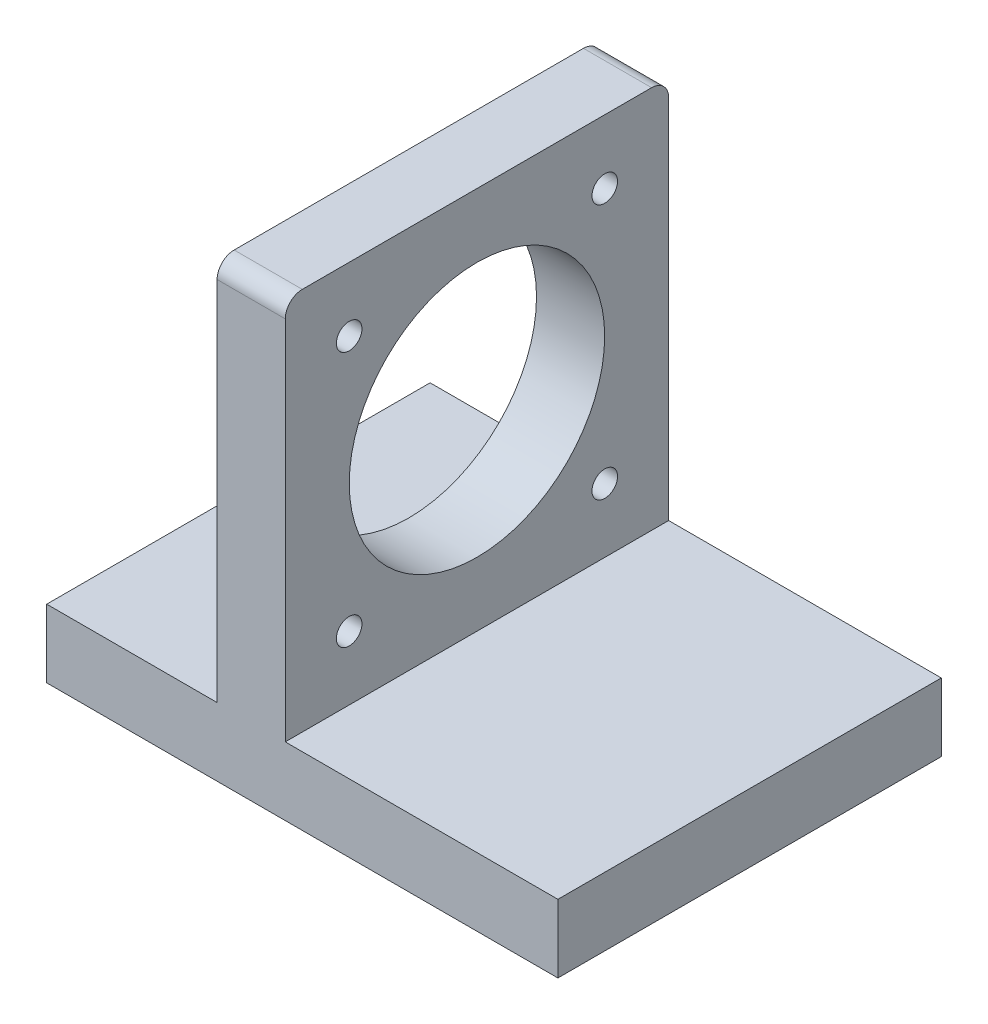
ISO-10303-21;
HEADER;
FILE_DESCRIPTION(('STEP AP214'),'2;1');
FILE_NAME('part.step','',(''),(''),'','','');
FILE_SCHEMA(('AUTOMOTIVE_DESIGN { 1 0 10303 214 1 1 1 1 }'));
ENDSEC;
DATA;
#1=APPLICATION_CONTEXT('core data for automotive mechanical design processes');
#2=APPLICATION_PROTOCOL_DEFINITION('international standard','automotive_design',2000,#1);
#3=PRODUCT_CONTEXT('',#1,'mechanical');
#4=PRODUCT('Part','Part','',(#3));
#5=PRODUCT_RELATED_PRODUCT_CATEGORY('part','',(#4));
#6=PRODUCT_DEFINITION_FORMATION('','',#4);
#7=PRODUCT_DEFINITION_CONTEXT('part definition',#1,'design');
#8=PRODUCT_DEFINITION('design','',#6,#7);
#9=PRODUCT_DEFINITION_SHAPE('','',#8);
#10=(LENGTH_UNIT() NAMED_UNIT(*) SI_UNIT(.MILLI.,.METRE.));
#11=(NAMED_UNIT(*) PLANE_ANGLE_UNIT() SI_UNIT($,.RADIAN.));
#12=(NAMED_UNIT(*) SI_UNIT($,.STERADIAN.) SOLID_ANGLE_UNIT());
#13=UNCERTAINTY_MEASURE_WITH_UNIT(LENGTH_MEASURE(1.E-05),#10,'distance_accuracy_value','');
#14=(GEOMETRIC_REPRESENTATION_CONTEXT(3) GLOBAL_UNCERTAINTY_ASSIGNED_CONTEXT((#13)) GLOBAL_UNIT_ASSIGNED_CONTEXT((#10,
#11,#12)) REPRESENTATION_CONTEXT('',''));
#15=CARTESIAN_POINT('',(0.,0.,0.));
#16=DIRECTION('',(0.,0.,1.));
#17=DIRECTION('',(1.,0.,0.));
#18=AXIS2_PLACEMENT_3D('',#15,#16,#17);
#19=CARTESIAN_POINT('',(0.,8.,0.));
#20=DIRECTION('',(0.,1.,0.));
#21=DIRECTION('',(0.,0.,1.));
#22=AXIS2_PLACEMENT_3D('',#19,#20,#21);
#23=PLANE('',#22);
#24=DIRECTION('',(0.,0.,-1.));
#25=VECTOR('',#24,1.);
#26=CARTESIAN_POINT('',(-2.,8.,22.5));
#27=LINE('',#26,#25);
#28=CARTESIAN_POINT('',(-2.,8.,22.5));
#29=VERTEX_POINT('',#28);
#30=CARTESIAN_POINT('',(-2.00000000000001,8.,-22.5));
#31=VERTEX_POINT('',#30);
#32=EDGE_CURVE('E160',#29,#31,#27,.T.);
#33=ORIENTED_EDGE('',*,*,#32,.F.);
#34=DIRECTION('',(1.,0.,0.));
#35=VECTOR('',#34,1.);
#36=CARTESIAN_POINT('',(-30.,8.,22.5));
#37=LINE('',#36,#35);
#38=CARTESIAN_POINT('',(30.,8.,22.5));
#39=VERTEX_POINT('',#38);
#40=EDGE_CURVE('E156',#29,#39,#37,.T.);
#41=ORIENTED_EDGE('',*,*,#40,.T.);
#42=DIRECTION('',(0.,0.,-1.));
#43=VECTOR('',#42,1.);
#44=CARTESIAN_POINT('',(30.,8.,-22.5));
#45=LINE('',#44,#43);
#46=CARTESIAN_POINT('',(30.,8.,-22.5));
#47=VERTEX_POINT('',#46);
#48=EDGE_CURVE('E222',#39,#47,#45,.T.);
#49=ORIENTED_EDGE('',*,*,#48,.T.);
#50=DIRECTION('',(-1.,0.,0.));
#51=VECTOR('',#50,1.);
#52=CARTESIAN_POINT('',(-30.,8.,-22.5));
#53=LINE('',#52,#51);
#54=EDGE_CURVE('E227',#47,#31,#53,.T.);
#55=ORIENTED_EDGE('',*,*,#54,.T.);
#56=EDGE_LOOP('',(#33,#41,#49,#55));
#57=FACE_BOUND('',#56,.T.);
#58=ADVANCED_FACE('F33',(#57),#23,.T.);
#59=CARTESIAN_POINT('',(30.,8.,-22.5));
#60=DIRECTION('',(-1.,0.,0.));
#61=DIRECTION('',(0.,0.,1.));
#62=AXIS2_PLACEMENT_3D('',#59,#60,#61);
#63=PLANE('',#62);
#64=DIRECTION('',(0.,0.,-1.));
#65=VECTOR('',#64,1.);
#66=CARTESIAN_POINT('',(30.,0.,-22.5));
#67=LINE('',#66,#65);
#68=CARTESIAN_POINT('',(30.,0.,22.5));
#69=VERTEX_POINT('',#68);
#70=CARTESIAN_POINT('',(30.,0.,-22.5));
#71=VERTEX_POINT('',#70);
#72=EDGE_CURVE('E213',#69,#71,#67,.T.);
#73=ORIENTED_EDGE('',*,*,#72,.T.);
#74=DIRECTION('',(0.,-1.,0.));
#75=VECTOR('',#74,1.);
#76=CARTESIAN_POINT('',(30.,8.,-22.5));
#77=LINE('',#76,#75);
#78=EDGE_CURVE('E245',#47,#71,#77,.T.);
#79=ORIENTED_EDGE('',*,*,#78,.F.);
#80=ORIENTED_EDGE('',*,*,#48,.F.);
#81=DIRECTION('',(0.,-1.,0.));
#82=VECTOR('',#81,1.);
#83=CARTESIAN_POINT('',(30.,8.,22.5));
#84=LINE('',#83,#82);
#85=EDGE_CURVE('E155',#39,#69,#84,.T.);
#86=ORIENTED_EDGE('',*,*,#85,.T.);
#87=EDGE_LOOP('',(#73,#79,#80,#86));
#88=FACE_BOUND('',#87,.T.);
#89=ADVANCED_FACE('F291',(#88),#63,.F.);
#90=CARTESIAN_POINT('',(-30.,8.,-22.5));
#91=DIRECTION('',(0.,0.,1.));
#92=DIRECTION('',(1.,0.,0.));
#93=AXIS2_PLACEMENT_3D('',#90,#91,#92);
#94=PLANE('',#93);
#95=DIRECTION('',(0.,-1.,0.));
#96=VECTOR('',#95,1.);
#97=CARTESIAN_POINT('',(-10.,53.,-22.5));
#98=LINE('',#97,#96);
#99=CARTESIAN_POINT('',(-10.,51.,-22.5));
#100=VERTEX_POINT('',#99);
#101=CARTESIAN_POINT('',(-10.,8.,-22.5));
#102=VERTEX_POINT('',#101);
#103=EDGE_CURVE('E144',#100,#102,#98,.T.);
#104=ORIENTED_EDGE('',*,*,#103,.F.);
#105=DIRECTION('',(-1.,0.,0.));
#106=VECTOR('',#105,1.);
#107=CARTESIAN_POINT('',(-2.,51.,-22.5));
#108=LINE('',#107,#106);
#109=CARTESIAN_POINT('',(-2.,51.,-22.5));
#110=VERTEX_POINT('',#109);
#111=EDGE_CURVE('E57',#100,#110,#108,.F.);
#112=ORIENTED_EDGE('',*,*,#111,.T.);
#113=DIRECTION('',(0.,-1.,0.));
#114=VECTOR('',#113,1.);
#115=CARTESIAN_POINT('',(-2.,53.,-22.5));
#116=LINE('',#115,#114);
#117=EDGE_CURVE('E173',#110,#31,#116,.T.);
#118=ORIENTED_EDGE('',*,*,#117,.T.);
#119=ORIENTED_EDGE('',*,*,#54,.F.);
#120=ORIENTED_EDGE('',*,*,#78,.T.);
#121=DIRECTION('',(-1.,0.,0.));
#122=VECTOR('',#121,1.);
#123=CARTESIAN_POINT('',(-30.,0.,-22.5));
#124=LINE('',#123,#122);
#125=CARTESIAN_POINT('',(-30.,0.,-22.5));
#126=VERTEX_POINT('',#125);
#127=EDGE_CURVE('E233',#71,#126,#124,.T.);
#128=ORIENTED_EDGE('',*,*,#127,.T.);
#129=DIRECTION('',(0.,-1.,0.));
#130=VECTOR('',#129,1.);
#131=CARTESIAN_POINT('',(-30.,8.,-22.5));
#132=LINE('',#131,#130);
#133=CARTESIAN_POINT('',(-30.,8.,-22.5));
#134=VERTEX_POINT('',#133);
#135=EDGE_CURVE('E242',#134,#126,#132,.T.);
#136=ORIENTED_EDGE('',*,*,#135,.F.);
#137=EDGE_CURVE('E225',#102,#134,#53,.T.);
#138=ORIENTED_EDGE('',*,*,#137,.F.);
#139=EDGE_LOOP('',(#104,#112,#118,#119,#120,#128,#136,#138));
#140=FACE_BOUND('',#139,.T.);
#141=ADVANCED_FACE('F279',(#140),#94,.F.);
#142=CARTESIAN_POINT('',(-30.,8.,-22.5));
#143=DIRECTION('',(1.,0.,0.));
#144=DIRECTION('',(0.,0.,-1.));
#145=AXIS2_PLACEMENT_3D('',#142,#143,#144);
#146=PLANE('',#145);
#147=DIRECTION('',(0.,0.,1.));
#148=VECTOR('',#147,1.);
#149=CARTESIAN_POINT('',(-30.,0.,-22.5));
#150=LINE('',#149,#148);
#151=CARTESIAN_POINT('',(-30.,0.,22.5));
#152=VERTEX_POINT('',#151);
#153=EDGE_CURVE('E235',#126,#152,#150,.T.);
#154=ORIENTED_EDGE('',*,*,#153,.T.);
#155=DIRECTION('',(0.,-1.,0.));
#156=VECTOR('',#155,1.);
#157=CARTESIAN_POINT('',(-30.,8.,22.5));
#158=LINE('',#157,#156);
#159=CARTESIAN_POINT('',(-30.,8.,22.5));
#160=VERTEX_POINT('',#159);
#161=EDGE_CURVE('E240',#160,#152,#158,.T.);
#162=ORIENTED_EDGE('',*,*,#161,.F.);
#163=DIRECTION('',(0.,0.,1.));
#164=VECTOR('',#163,1.);
#165=CARTESIAN_POINT('',(-30.,8.,-22.5));
#166=LINE('',#165,#164);
#167=EDGE_CURVE('E153',#134,#160,#166,.T.);
#168=ORIENTED_EDGE('',*,*,#167,.F.);
#169=ORIENTED_EDGE('',*,*,#135,.T.);
#170=EDGE_LOOP('',(#154,#162,#168,#169));
#171=FACE_BOUND('',#170,.T.);
#172=ADVANCED_FACE('F283',(#171),#146,.F.);
#173=CARTESIAN_POINT('',(-30.,8.,22.5));
#174=DIRECTION('',(0.,0.,-1.));
#175=DIRECTION('',(-1.,0.,0.));
#176=AXIS2_PLACEMENT_3D('',#173,#174,#175);
#177=PLANE('',#176);
#178=DIRECTION('',(0.,-1.,0.));
#179=VECTOR('',#178,1.);
#180=CARTESIAN_POINT('',(-2.,53.,22.5));
#181=LINE('',#180,#179);
#182=CARTESIAN_POINT('',(-2.,51.,22.5));
#183=VERTEX_POINT('',#182);
#184=EDGE_CURVE('E145',#183,#29,#181,.T.);
#185=ORIENTED_EDGE('',*,*,#184,.F.);
#186=DIRECTION('',(1.,0.,0.));
#187=VECTOR('',#186,1.);
#188=CARTESIAN_POINT('',(-9.99999999999999,51.,22.5));
#189=LINE('',#188,#187);
#190=CARTESIAN_POINT('',(-9.99999999999999,51.,22.5));
#191=VERTEX_POINT('',#190);
#192=EDGE_CURVE('E11',#183,#191,#189,.F.);
#193=ORIENTED_EDGE('',*,*,#192,.T.);
#194=DIRECTION('',(0.,-1.,0.));
#195=VECTOR('',#194,1.);
#196=CARTESIAN_POINT('',(-9.99999999999999,53.,22.5));
#197=LINE('',#196,#195);
#198=CARTESIAN_POINT('',(-9.99999999999999,8.,22.5));
#199=VERTEX_POINT('',#198);
#200=EDGE_CURVE('E135',#191,#199,#197,.T.);
#201=ORIENTED_EDGE('',*,*,#200,.T.);
#202=EDGE_CURVE('E139',#160,#199,#37,.T.);
#203=ORIENTED_EDGE('',*,*,#202,.F.);
#204=ORIENTED_EDGE('',*,*,#161,.T.);
#205=DIRECTION('',(1.,0.,0.));
#206=VECTOR('',#205,1.);
#207=CARTESIAN_POINT('',(-30.,0.,22.5));
#208=LINE('',#207,#206);
#209=EDGE_CURVE('E226',#152,#69,#208,.T.);
#210=ORIENTED_EDGE('',*,*,#209,.T.);
#211=ORIENTED_EDGE('',*,*,#85,.F.);
#212=ORIENTED_EDGE('',*,*,#40,.F.);
#213=EDGE_LOOP('',(#185,#193,#201,#203,#204,#210,#211,#212));
#214=FACE_BOUND('',#213,.T.);
#215=ADVANCED_FACE('F137',(#214),#177,.F.);
#216=DIRECTION('',(0.,0.,1.));
#217=VECTOR('',#216,1.);
#218=CARTESIAN_POINT('',(-9.99999999999999,8.,22.5));
#219=LINE('',#218,#217);
#220=EDGE_CURVE('E150',#102,#199,#219,.T.);
#221=ORIENTED_EDGE('',*,*,#220,.F.);
#222=ORIENTED_EDGE('',*,*,#137,.T.);
#223=ORIENTED_EDGE('',*,*,#167,.T.);
#224=ORIENTED_EDGE('',*,*,#202,.T.);
#225=EDGE_LOOP('',(#221,#222,#223,#224));
#226=FACE_BOUND('',#225,.T.);
#227=ADVANCED_FACE('F149',(#226),#23,.T.);
#228=CARTESIAN_POINT('',(0.,0.,0.));
#229=DIRECTION('',(0.,1.,0.));
#230=DIRECTION('',(0.,0.,1.));
#231=AXIS2_PLACEMENT_3D('',#228,#229,#230);
#232=PLANE('',#231);
#233=DIRECTION('',(1.,0.,0.));
#234=VECTOR('',#233,1.);
#235=CARTESIAN_POINT('',(-9.99999999999999,0.,-20.));
#236=LINE('',#235,#234);
#237=CARTESIAN_POINT('',(-9.99999999999999,0.,-20.));
#238=VERTEX_POINT('',#237);
#239=CARTESIAN_POINT('',(10.,0.,-20.));
#240=VERTEX_POINT('',#239);
#241=EDGE_CURVE('E193',#238,#240,#236,.T.);
#242=ORIENTED_EDGE('',*,*,#241,.F.);
#243=DIRECTION('',(0.,0.,-1.));
#244=VECTOR('',#243,1.);
#245=CARTESIAN_POINT('',(-10.,0.,20.));
#246=LINE('',#245,#244);
#247=CARTESIAN_POINT('',(-10.,0.,20.));
#248=VERTEX_POINT('',#247);
#249=EDGE_CURVE('E177',#248,#238,#246,.T.);
#250=ORIENTED_EDGE('',*,*,#249,.F.);
#251=DIRECTION('',(-1.,0.,0.));
#252=VECTOR('',#251,1.);
#253=CARTESIAN_POINT('',(-10.,0.,20.));
#254=LINE('',#253,#252);
#255=CARTESIAN_POINT('',(10.,0.,20.));
#256=VERTEX_POINT('',#255);
#257=EDGE_CURVE('E182',#256,#248,#254,.T.);
#258=ORIENTED_EDGE('',*,*,#257,.F.);
#259=DIRECTION('',(0.,0.,1.));
#260=VECTOR('',#259,1.);
#261=CARTESIAN_POINT('',(10.,0.,20.));
#262=LINE('',#261,#260);
#263=EDGE_CURVE('E196',#240,#256,#262,.T.);
#264=ORIENTED_EDGE('',*,*,#263,.F.);
#265=EDGE_LOOP('',(#242,#250,#258,#264));
#266=FACE_BOUND('',#265,.T.);
#267=CARTESIAN_POINT('',(-20.,0.,14.5));
#268=DIRECTION('',(0.,-1.,0.));
#269=DIRECTION('',(0.,0.,-1.));
#270=AXIS2_PLACEMENT_3D('',#267,#268,#269);
#271=CIRCLE('',#270,5.);
#272=CARTESIAN_POINT('',(-20.,0.,9.50000000000001));
#273=VERTEX_POINT('',#272);
#274=EDGE_CURVE('E214',#273,#273,#271,.T.);
#275=ORIENTED_EDGE('',*,*,#274,.F.);
#276=EDGE_LOOP('',(#275));
#277=FACE_BOUND('',#276,.T.);
#278=CARTESIAN_POINT('',(-20.,0.,-14.5));
#279=DIRECTION('',(0.,-1.,0.));
#280=DIRECTION('',(0.,0.,-1.));
#281=AXIS2_PLACEMENT_3D('',#278,#279,#280);
#282=CIRCLE('',#281,5.);
#283=CARTESIAN_POINT('',(-20.,0.,-19.5));
#284=VERTEX_POINT('',#283);
#285=EDGE_CURVE('E203',#284,#284,#282,.T.);
#286=ORIENTED_EDGE('',*,*,#285,.F.);
#287=EDGE_LOOP('',(#286));
#288=FACE_BOUND('',#287,.T.);
#289=ORIENTED_EDGE('',*,*,#72,.F.);
#290=ORIENTED_EDGE('',*,*,#209,.F.);
#291=ORIENTED_EDGE('',*,*,#153,.F.);
#292=ORIENTED_EDGE('',*,*,#127,.F.);
#293=EDGE_LOOP('',(#289,#290,#291,#292));
#294=FACE_BOUND('',#293,.T.);
#295=ADVANCED_FACE('F288',(#266,#277,#288,#294),#232,.F.);
#296=CARTESIAN_POINT('',(-20.,5.,-14.5));
#297=DIRECTION('',(0.,-1.,0.));
#298=DIRECTION('',(0.,0.,-1.));
#299=AXIS2_PLACEMENT_3D('',#296,#297,#298);
#300=CYLINDRICAL_SURFACE('',#299,5.);
#301=CARTESIAN_POINT('',(-20.,5.,-14.5));
#302=DIRECTION('',(0.,-1.,0.));
#303=DIRECTION('',(0.,0.,-1.));
#304=AXIS2_PLACEMENT_3D('',#301,#302,#303);
#305=CIRCLE('',#304,5.);
#306=CARTESIAN_POINT('',(-20.,5.,-19.5));
#307=VERTEX_POINT('',#306);
#308=EDGE_CURVE('E217',#307,#307,#305,.T.);
#309=ORIENTED_EDGE('',*,*,#308,.F.);
#310=EDGE_LOOP('',(#309));
#311=FACE_BOUND('',#310,.T.);
#312=ORIENTED_EDGE('',*,*,#285,.T.);
#313=EDGE_LOOP('',(#312));
#314=FACE_BOUND('',#313,.T.);
#315=ADVANCED_FACE('F309',(#311,#314),#300,.F.);
#316=CARTESIAN_POINT('',(-20.,5.,-14.5));
#317=DIRECTION('',(0.,-1.,0.));
#318=DIRECTION('',(0.,0.,-1.));
#319=AXIS2_PLACEMENT_3D('',#316,#317,#318);
#320=PLANE('',#319);
#321=ORIENTED_EDGE('',*,*,#308,.T.);
#322=EDGE_LOOP('',(#321));
#323=FACE_BOUND('',#322,.T.);
#324=ADVANCED_FACE('F378',(#323),#320,.T.);
#325=CARTESIAN_POINT('',(-20.,5.,14.5));
#326=DIRECTION('',(0.,-1.,0.));
#327=DIRECTION('',(0.,0.,-1.));
#328=AXIS2_PLACEMENT_3D('',#325,#326,#327);
#329=CYLINDRICAL_SURFACE('',#328,5.);
#330=CARTESIAN_POINT('',(-20.,5.,14.5));
#331=DIRECTION('',(0.,-1.,0.));
#332=DIRECTION('',(0.,0.,-1.));
#333=AXIS2_PLACEMENT_3D('',#330,#331,#332);
#334=CIRCLE('',#333,5.);
#335=CARTESIAN_POINT('',(-20.,5.,9.50000000000001));
#336=VERTEX_POINT('',#335);
#337=EDGE_CURVE('E210',#336,#336,#334,.T.);
#338=ORIENTED_EDGE('',*,*,#337,.F.);
#339=EDGE_LOOP('',(#338));
#340=FACE_BOUND('',#339,.T.);
#341=ORIENTED_EDGE('',*,*,#274,.T.);
#342=EDGE_LOOP('',(#341));
#343=FACE_BOUND('',#342,.T.);
#344=ADVANCED_FACE('F374',(#340,#343),#329,.F.);
#345=CARTESIAN_POINT('',(-20.,5.,14.5));
#346=DIRECTION('',(0.,-1.,0.));
#347=DIRECTION('',(0.,0.,-1.));
#348=AXIS2_PLACEMENT_3D('',#345,#346,#347);
#349=PLANE('',#348);
#350=ORIENTED_EDGE('',*,*,#337,.T.);
#351=EDGE_LOOP('',(#350));
#352=FACE_BOUND('',#351,.T.);
#353=ADVANCED_FACE('F370',(#352),#349,.T.);
#354=CARTESIAN_POINT('',(-10.,5.,20.));
#355=DIRECTION('',(-1.,0.,0.));
#356=DIRECTION('',(0.,0.,1.));
#357=AXIS2_PLACEMENT_3D('',#354,#355,#356);
#358=PLANE('',#357);
#359=ORIENTED_EDGE('',*,*,#249,.T.);
#360=DIRECTION('',(0.,-1.,0.));
#361=VECTOR('',#360,1.);
#362=CARTESIAN_POINT('',(-9.99999999999999,5.,-20.));
#363=LINE('',#362,#361);
#364=CARTESIAN_POINT('',(-9.99999999999999,5.,-20.));
#365=VERTEX_POINT('',#364);
#366=EDGE_CURVE('E191',#365,#238,#363,.T.);
#367=ORIENTED_EDGE('',*,*,#366,.F.);
#368=DIRECTION('',(0.,0.,-1.));
#369=VECTOR('',#368,1.);
#370=CARTESIAN_POINT('',(-10.,5.,20.));
#371=LINE('',#370,#369);
#372=CARTESIAN_POINT('',(-10.,5.,20.));
#373=VERTEX_POINT('',#372);
#374=EDGE_CURVE('E178',#373,#365,#371,.T.);
#375=ORIENTED_EDGE('',*,*,#374,.F.);
#376=DIRECTION('',(0.,-1.,0.));
#377=VECTOR('',#376,1.);
#378=CARTESIAN_POINT('',(-10.,5.,20.));
#379=LINE('',#378,#377);
#380=EDGE_CURVE('E201',#373,#248,#379,.T.);
#381=ORIENTED_EDGE('',*,*,#380,.T.);
#382=EDGE_LOOP('',(#359,#367,#375,#381));
#383=FACE_BOUND('',#382,.T.);
#384=ADVANCED_FACE('F360',(#383),#358,.F.);
#385=CARTESIAN_POINT('',(-10.,5.,20.));
#386=DIRECTION('',(0.,0.,1.));
#387=DIRECTION('',(1.,0.,0.));
#388=AXIS2_PLACEMENT_3D('',#385,#386,#387);
#389=PLANE('',#388);
#390=ORIENTED_EDGE('',*,*,#257,.T.);
#391=ORIENTED_EDGE('',*,*,#380,.F.);
#392=DIRECTION('',(-1.,0.,0.));
#393=VECTOR('',#392,1.);
#394=CARTESIAN_POINT('',(-10.,5.,20.));
#395=LINE('',#394,#393);
#396=CARTESIAN_POINT('',(10.,5.,20.));
#397=VERTEX_POINT('',#396);
#398=EDGE_CURVE('E188',#397,#373,#395,.T.);
#399=ORIENTED_EDGE('',*,*,#398,.F.);
#400=DIRECTION('',(0.,-1.,0.));
#401=VECTOR('',#400,1.);
#402=CARTESIAN_POINT('',(10.,5.,20.));
#403=LINE('',#402,#401);
#404=EDGE_CURVE('E204',#397,#256,#403,.T.);
#405=ORIENTED_EDGE('',*,*,#404,.T.);
#406=EDGE_LOOP('',(#390,#391,#399,#405));
#407=FACE_BOUND('',#406,.T.);
#408=ADVANCED_FACE('F356',(#407),#389,.F.);
#409=CARTESIAN_POINT('',(10.,5.,20.));
#410=DIRECTION('',(1.,0.,0.));
#411=DIRECTION('',(0.,0.,-1.));
#412=AXIS2_PLACEMENT_3D('',#409,#410,#411);
#413=PLANE('',#412);
#414=ORIENTED_EDGE('',*,*,#263,.T.);
#415=ORIENTED_EDGE('',*,*,#404,.F.);
#416=DIRECTION('',(0.,0.,1.));
#417=VECTOR('',#416,1.);
#418=CARTESIAN_POINT('',(10.,5.,20.));
#419=LINE('',#418,#417);
#420=CARTESIAN_POINT('',(10.,5.,-20.));
#421=VERTEX_POINT('',#420);
#422=EDGE_CURVE('E185',#421,#397,#419,.T.);
#423=ORIENTED_EDGE('',*,*,#422,.F.);
#424=DIRECTION('',(0.,-1.,0.));
#425=VECTOR('',#424,1.);
#426=CARTESIAN_POINT('',(10.,5.,-20.));
#427=LINE('',#426,#425);
#428=EDGE_CURVE('E206',#421,#240,#427,.T.);
#429=ORIENTED_EDGE('',*,*,#428,.T.);
#430=EDGE_LOOP('',(#414,#415,#423,#429));
#431=FACE_BOUND('',#430,.T.);
#432=ADVANCED_FACE('F359',(#431),#413,.F.);
#433=CARTESIAN_POINT('',(-9.99999999999999,5.,-20.));
#434=DIRECTION('',(0.,0.,-1.));
#435=DIRECTION('',(-1.,0.,0.));
#436=AXIS2_PLACEMENT_3D('',#433,#434,#435);
#437=PLANE('',#436);
#438=ORIENTED_EDGE('',*,*,#241,.T.);
#439=ORIENTED_EDGE('',*,*,#428,.F.);
#440=DIRECTION('',(1.,0.,0.));
#441=VECTOR('',#440,1.);
#442=CARTESIAN_POINT('',(-9.99999999999999,5.,-20.));
#443=LINE('',#442,#441);
#444=EDGE_CURVE('E181',#365,#421,#443,.T.);
#445=ORIENTED_EDGE('',*,*,#444,.F.);
#446=ORIENTED_EDGE('',*,*,#366,.T.);
#447=EDGE_LOOP('',(#438,#439,#445,#446));
#448=FACE_BOUND('',#447,.T.);
#449=ADVANCED_FACE('F354',(#448),#437,.F.);
#450=CARTESIAN_POINT('',(0.,5.,0.));
#451=DIRECTION('',(0.,-1.,0.));
#452=DIRECTION('',(0.,0.,-1.));
#453=AXIS2_PLACEMENT_3D('',#450,#451,#452);
#454=PLANE('',#453);
#455=ORIENTED_EDGE('',*,*,#374,.T.);
#456=ORIENTED_EDGE('',*,*,#444,.T.);
#457=ORIENTED_EDGE('',*,*,#422,.T.);
#458=ORIENTED_EDGE('',*,*,#398,.T.);
#459=EDGE_LOOP('',(#455,#456,#457,#458));
#460=FACE_BOUND('',#459,.T.);
#461=ADVANCED_FACE('F350',(#460),#454,.T.);
#462=CARTESIAN_POINT('',(-9.99999999999999,53.,22.5));
#463=DIRECTION('',(1.,0.,0.));
#464=DIRECTION('',(0.,0.,-1.));
#465=AXIS2_PLACEMENT_3D('',#462,#463,#464);
#466=PLANE('',#465);
#467=CARTESIAN_POINT('',(-10.,30.5,0.));
#468=DIRECTION('',(-1.,0.,0.));
#469=DIRECTION('',(0.,0.,1.));
#470=AXIS2_PLACEMENT_3D('',#467,#468,#469);
#471=CIRCLE('',#470,14.9902404199975);
#472=CARTESIAN_POINT('',(-10.,30.5,14.9902404199975));
#473=VERTEX_POINT('',#472);
#474=EDGE_CURVE('E542',#473,#473,#471,.T.);
#475=ORIENTED_EDGE('',*,*,#474,.F.);
#476=EDGE_LOOP('',(#475));
#477=FACE_BOUND('',#476,.T.);
#478=CARTESIAN_POINT('',(-10.,15.5,-15.));
#479=DIRECTION('',(-1.,0.,0.));
#480=DIRECTION('',(0.,0.,1.));
#481=AXIS2_PLACEMENT_3D('',#478,#479,#480);
#482=CIRCLE('',#481,1.5);
#483=CARTESIAN_POINT('',(-10.,15.5,-13.5));
#484=VERTEX_POINT('',#483);
#485=EDGE_CURVE('E545',#484,#484,#482,.T.);
#486=ORIENTED_EDGE('',*,*,#485,.F.);
#487=EDGE_LOOP('',(#486));
#488=FACE_BOUND('',#487,.T.);
#489=CARTESIAN_POINT('',(-10.,15.5,15.));
#490=DIRECTION('',(-1.,0.,0.));
#491=DIRECTION('',(0.,0.,1.));
#492=AXIS2_PLACEMENT_3D('',#489,#490,#491);
#493=CIRCLE('',#492,1.5);
#494=CARTESIAN_POINT('',(-10.,15.5,16.5));
#495=VERTEX_POINT('',#494);
#496=EDGE_CURVE('E546',#495,#495,#493,.T.);
#497=ORIENTED_EDGE('',*,*,#496,.F.);
#498=EDGE_LOOP('',(#497));
#499=FACE_BOUND('',#498,.T.);
#500=CARTESIAN_POINT('',(-10.,45.5,15.));
#501=DIRECTION('',(-1.,0.,0.));
#502=DIRECTION('',(0.,0.,1.));
#503=AXIS2_PLACEMENT_3D('',#500,#501,#502);
#504=CIRCLE('',#503,1.5);
#505=CARTESIAN_POINT('',(-10.,45.5,16.5));
#506=VERTEX_POINT('',#505);
#507=EDGE_CURVE('E550',#506,#506,#504,.T.);
#508=ORIENTED_EDGE('',*,*,#507,.F.);
#509=EDGE_LOOP('',(#508));
#510=FACE_BOUND('',#509,.T.);
#511=CARTESIAN_POINT('',(-10.,45.5,-15.));
#512=DIRECTION('',(-1.,0.,0.));
#513=DIRECTION('',(0.,0.,1.));
#514=AXIS2_PLACEMENT_3D('',#511,#512,#513);
#515=CIRCLE('',#514,1.5);
#516=CARTESIAN_POINT('',(-10.,45.5,-13.5));
#517=VERTEX_POINT('',#516);
#518=EDGE_CURVE('E253',#517,#517,#515,.T.);
#519=ORIENTED_EDGE('',*,*,#518,.F.);
#520=EDGE_LOOP('',(#519));
#521=FACE_BOUND('',#520,.T.);
#522=DIRECTION('',(0.,0.,1.));
#523=VECTOR('',#522,1.);
#524=CARTESIAN_POINT('',(-9.99999999999999,53.,22.5));
#525=LINE('',#524,#523);
#526=CARTESIAN_POINT('',(-10.,53.,-20.5));
#527=VERTEX_POINT('',#526);
#528=CARTESIAN_POINT('',(-9.99999999999999,53.,20.5));
#529=VERTEX_POINT('',#528);
#530=EDGE_CURVE('E164',#527,#529,#525,.T.);
#531=ORIENTED_EDGE('',*,*,#530,.F.);
#532=CARTESIAN_POINT('',(-10.,51.,-20.5));
#533=DIRECTION('',(1.,0.,0.));
#534=DIRECTION('',(0.,0.,-1.));
#535=AXIS2_PLACEMENT_3D('',#532,#533,#534);
#536=CIRCLE('',#535,2.);
#537=EDGE_CURVE('E265',#527,#100,#536,.F.);
#538=ORIENTED_EDGE('',*,*,#537,.T.);
#539=ORIENTED_EDGE('',*,*,#103,.T.);
#540=ORIENTED_EDGE('',*,*,#220,.T.);
#541=ORIENTED_EDGE('',*,*,#200,.F.);
#542=CARTESIAN_POINT('',(-9.99999999999999,51.,20.5));
#543=DIRECTION('',(1.,0.,0.));
#544=DIRECTION('',(0.,0.,-1.));
#545=AXIS2_PLACEMENT_3D('',#542,#543,#544);
#546=CIRCLE('',#545,2.);
#547=EDGE_CURVE('E263',#191,#529,#546,.F.);
#548=ORIENTED_EDGE('',*,*,#547,.T.);
#549=EDGE_LOOP('',(#531,#538,#539,#540,#541,#548));
#550=FACE_BOUND('',#549,.T.);
#551=ADVANCED_FACE('F159',(#477,#488,#499,#510,#521,#550),#466,.F.);
#552=CARTESIAN_POINT('',(-2.,53.,22.5));
#553=DIRECTION('',(-1.,0.,0.));
#554=DIRECTION('',(0.,0.,1.));
#555=AXIS2_PLACEMENT_3D('',#552,#553,#554);
#556=PLANE('',#555);
#557=CARTESIAN_POINT('',(-1.99999999999999,30.5,0.));
#558=DIRECTION('',(-1.,0.,0.));
#559=DIRECTION('',(0.,0.,1.));
#560=AXIS2_PLACEMENT_3D('',#557,#558,#559);
#561=CIRCLE('',#560,14.9902404199975);
#562=CARTESIAN_POINT('',(-1.99999999999999,30.5,14.9902404199975));
#563=VERTEX_POINT('',#562);
#564=EDGE_CURVE('E37',#563,#563,#561,.T.);
#565=ORIENTED_EDGE('',*,*,#564,.T.);
#566=EDGE_LOOP('',(#565));
#567=FACE_BOUND('',#566,.T.);
#568=CARTESIAN_POINT('',(-1.99999999999999,15.5,-15.));
#569=DIRECTION('',(-1.,0.,0.));
#570=DIRECTION('',(0.,0.,1.));
#571=AXIS2_PLACEMENT_3D('',#568,#569,#570);
#572=CIRCLE('',#571,1.5);
#573=CARTESIAN_POINT('',(-1.99999999999999,15.5,-13.5));
#574=VERTEX_POINT('',#573);
#575=EDGE_CURVE('E161',#574,#574,#572,.T.);
#576=ORIENTED_EDGE('',*,*,#575,.T.);
#577=EDGE_LOOP('',(#576));
#578=FACE_BOUND('',#577,.T.);
#579=CARTESIAN_POINT('',(-1.99999999999999,15.5,15.));
#580=DIRECTION('',(-1.,0.,0.));
#581=DIRECTION('',(0.,0.,1.));
#582=AXIS2_PLACEMENT_3D('',#579,#580,#581);
#583=CIRCLE('',#582,1.5);
#584=CARTESIAN_POINT('',(-1.99999999999999,15.5,16.5));
#585=VERTEX_POINT('',#584);
#586=EDGE_CURVE('E167',#585,#585,#583,.T.);
#587=ORIENTED_EDGE('',*,*,#586,.T.);
#588=EDGE_LOOP('',(#587));
#589=FACE_BOUND('',#588,.T.);
#590=CARTESIAN_POINT('',(-1.99999999999999,45.5,15.));
#591=DIRECTION('',(-1.,0.,0.));
#592=DIRECTION('',(0.,0.,1.));
#593=AXIS2_PLACEMENT_3D('',#590,#591,#592);
#594=CIRCLE('',#593,1.5);
#595=CARTESIAN_POINT('',(-1.99999999999999,45.5,16.5));
#596=VERTEX_POINT('',#595);
#597=EDGE_CURVE('E252',#596,#596,#594,.T.);
#598=ORIENTED_EDGE('',*,*,#597,.T.);
#599=EDGE_LOOP('',(#598));
#600=FACE_BOUND('',#599,.T.);
#601=CARTESIAN_POINT('',(-1.99999999999999,45.5,-15.));
#602=DIRECTION('',(-1.,0.,0.));
#603=DIRECTION('',(0.,0.,1.));
#604=AXIS2_PLACEMENT_3D('',#601,#602,#603);
#605=CIRCLE('',#604,1.5);
#606=CARTESIAN_POINT('',(-1.99999999999999,45.5,-13.5));
#607=VERTEX_POINT('',#606);
#608=EDGE_CURVE('E249',#607,#607,#605,.T.);
#609=ORIENTED_EDGE('',*,*,#608,.T.);
#610=EDGE_LOOP('',(#609));
#611=FACE_BOUND('',#610,.T.);
#612=ORIENTED_EDGE('',*,*,#117,.F.);
#613=CARTESIAN_POINT('',(-2.,51.,-20.5));
#614=DIRECTION('',(-1.,0.,0.));
#615=DIRECTION('',(0.,0.,1.));
#616=AXIS2_PLACEMENT_3D('',#613,#614,#615);
#617=CIRCLE('',#616,2.);
#618=CARTESIAN_POINT('',(-2.,53.,-20.5));
#619=VERTEX_POINT('',#618);
#620=EDGE_CURVE('E42',#110,#619,#617,.F.);
#621=ORIENTED_EDGE('',*,*,#620,.T.);
#622=DIRECTION('',(0.,0.,-1.));
#623=VECTOR('',#622,1.);
#624=CARTESIAN_POINT('',(-2.,53.,22.5));
#625=LINE('',#624,#623);
#626=CARTESIAN_POINT('',(-2.,53.,20.5));
#627=VERTEX_POINT('',#626);
#628=EDGE_CURVE('E170',#627,#619,#625,.T.);
#629=ORIENTED_EDGE('',*,*,#628,.F.);
#630=CARTESIAN_POINT('',(-2.,51.,20.5));
#631=DIRECTION('',(-1.,0.,0.));
#632=DIRECTION('',(0.,0.,1.));
#633=AXIS2_PLACEMENT_3D('',#630,#631,#632);
#634=CIRCLE('',#633,2.);
#635=EDGE_CURVE('E49',#627,#183,#634,.F.);
#636=ORIENTED_EDGE('',*,*,#635,.T.);
#637=ORIENTED_EDGE('',*,*,#184,.T.);
#638=ORIENTED_EDGE('',*,*,#32,.T.);
#639=EDGE_LOOP('',(#612,#621,#629,#636,#637,#638));
#640=FACE_BOUND('',#639,.T.);
#641=ADVANCED_FACE('F271',(#567,#578,#589,#600,#611,#640),#556,.F.);
#642=CARTESIAN_POINT('',(0.,53.,0.));
#643=DIRECTION('',(0.,1.,0.));
#644=DIRECTION('',(0.,0.,1.));
#645=AXIS2_PLACEMENT_3D('',#642,#643,#644);
#646=PLANE('',#645);
#647=ORIENTED_EDGE('',*,*,#628,.T.);
#648=DIRECTION('',(-1.,0.,0.));
#649=VECTOR('',#648,1.);
#650=CARTESIAN_POINT('',(-10.,53.,-20.5));
#651=LINE('',#650,#649);
#652=EDGE_CURVE('E260',#619,#527,#651,.T.);
#653=ORIENTED_EDGE('',*,*,#652,.T.);
#654=ORIENTED_EDGE('',*,*,#530,.T.);
#655=DIRECTION('',(1.,0.,0.));
#656=VECTOR('',#655,1.);
#657=CARTESIAN_POINT('',(-2.,53.,20.5));
#658=LINE('',#657,#656);
#659=EDGE_CURVE('E248',#529,#627,#658,.T.);
#660=ORIENTED_EDGE('',*,*,#659,.T.);
#661=EDGE_LOOP('',(#647,#653,#654,#660));
#662=FACE_BOUND('',#661,.T.);
#663=ADVANCED_FACE('F275',(#662),#646,.T.);
#664=CARTESIAN_POINT('',(35.,45.5,-15.));
#665=DIRECTION('',(-1.,0.,0.));
#666=DIRECTION('',(0.,0.,1.));
#667=AXIS2_PLACEMENT_3D('',#664,#665,#666);
#668=CYLINDRICAL_SURFACE('',#667,1.5);
#669=CARTESIAN_POINT('',(-10.,45.5,-13.5));
#670=CARTESIAN_POINT('',(-9.91666666666668,45.5,-13.5));
#671=CARTESIAN_POINT('',(-9.83333333333334,45.5,-13.5));
#672=CARTESIAN_POINT('',(-9.66666666666667,45.5,-13.5));
#673=CARTESIAN_POINT('',(-9.58333333333334,45.5,-13.5));
#674=CARTESIAN_POINT('',(-9.41666666666667,45.5,-13.5));
#675=CARTESIAN_POINT('',(-9.33333333333334,45.5,-13.5));
#676=CARTESIAN_POINT('',(-9.16666666666667,45.5,-13.5));
#677=CARTESIAN_POINT('',(-9.08333333333334,45.5,-13.5));
#678=CARTESIAN_POINT('',(-8.91666666666667,45.5,-13.5));
#679=CARTESIAN_POINT('',(-8.83333333333334,45.5,-13.5));
#680=CARTESIAN_POINT('',(-8.66666666666667,45.5,-13.5));
#681=CARTESIAN_POINT('',(-8.58333333333334,45.5,-13.5));
#682=CARTESIAN_POINT('',(-8.41666666666667,45.5,-13.5));
#683=CARTESIAN_POINT('',(-8.33333333333334,45.5,-13.5));
#684=CARTESIAN_POINT('',(-8.16666666666667,45.5,-13.5));
#685=CARTESIAN_POINT('',(-8.08333333333334,45.5,-13.5));
#686=CARTESIAN_POINT('',(-7.91666666666667,45.5,-13.5));
#687=CARTESIAN_POINT('',(-7.83333333333334,45.5,-13.5));
#688=CARTESIAN_POINT('',(-7.66666666666667,45.5,-13.5));
#689=CARTESIAN_POINT('',(-7.58333333333333,45.5,-13.5));
#690=CARTESIAN_POINT('',(-7.41666666666667,45.5,-13.5));
#691=CARTESIAN_POINT('',(-7.33333333333333,45.5,-13.5));
#692=CARTESIAN_POINT('',(-7.16666666666667,45.5,-13.5));
#693=CARTESIAN_POINT('',(-7.08333333333333,45.5,-13.5));
#694=CARTESIAN_POINT('',(-6.91666666666667,45.5,-13.5));
#695=CARTESIAN_POINT('',(-6.83333333333333,45.5,-13.5));
#696=CARTESIAN_POINT('',(-6.66666666666667,45.5,-13.5));
#697=CARTESIAN_POINT('',(-6.58333333333333,45.5,-13.5));
#698=CARTESIAN_POINT('',(-6.41666666666667,45.5,-13.5));
#699=CARTESIAN_POINT('',(-6.33333333333333,45.5,-13.5));
#700=CARTESIAN_POINT('',(-6.16666666666667,45.5,-13.5));
#701=CARTESIAN_POINT('',(-6.08333333333333,45.5,-13.5));
#702=CARTESIAN_POINT('',(-5.91666666666666,45.5,-13.5));
#703=CARTESIAN_POINT('',(-5.83333333333333,45.5,-13.5));
#704=CARTESIAN_POINT('',(-5.66666666666666,45.5,-13.5));
#705=CARTESIAN_POINT('',(-5.58333333333333,45.5,-13.5));
#706=CARTESIAN_POINT('',(-5.41666666666666,45.5,-13.5));
#707=CARTESIAN_POINT('',(-5.33333333333333,45.5,-13.5));
#708=CARTESIAN_POINT('',(-5.16666666666666,45.5,-13.5));
#709=CARTESIAN_POINT('',(-5.08333333333333,45.5,-13.5));
#710=CARTESIAN_POINT('',(-4.91666666666666,45.5,-13.5));
#711=CARTESIAN_POINT('',(-4.83333333333333,45.5,-13.5));
#712=CARTESIAN_POINT('',(-4.66666666666666,45.5,-13.5));
#713=CARTESIAN_POINT('',(-4.58333333333333,45.5,-13.5));
#714=CARTESIAN_POINT('',(-4.41666666666666,45.5,-13.5));
#715=CARTESIAN_POINT('',(-4.33333333333333,45.5,-13.5));
#716=CARTESIAN_POINT('',(-4.16666666666666,45.5,-13.5));
#717=CARTESIAN_POINT('',(-4.08333333333332,45.5,-13.5));
#718=CARTESIAN_POINT('',(-3.91666666666666,45.5,-13.5));
#719=CARTESIAN_POINT('',(-3.83333333333332,45.5,-13.5));
#720=CARTESIAN_POINT('',(-3.66666666666666,45.5,-13.5));
#721=CARTESIAN_POINT('',(-3.58333333333332,45.5,-13.5));
#722=CARTESIAN_POINT('',(-3.41666666666666,45.5,-13.5));
#723=CARTESIAN_POINT('',(-3.33333333333332,45.5,-13.5));
#724=CARTESIAN_POINT('',(-3.16666666666666,45.5,-13.5));
#725=CARTESIAN_POINT('',(-3.08333333333332,45.5,-13.5));
#726=CARTESIAN_POINT('',(-2.91666666666666,45.5,-13.5));
#727=CARTESIAN_POINT('',(-2.83333333333332,45.5,-13.5));
#728=CARTESIAN_POINT('',(-2.66666666666666,45.5,-13.5));
#729=CARTESIAN_POINT('',(-2.58333333333332,45.5,-13.5));
#730=CARTESIAN_POINT('',(-2.41666666666665,45.5,-13.5));
#731=CARTESIAN_POINT('',(-2.33333333333332,45.5,-13.5));
#732=CARTESIAN_POINT('',(-2.16666666666665,45.5,-13.5));
#733=CARTESIAN_POINT('',(-2.08333333333332,45.5,-13.5));
#734=CARTESIAN_POINT('',(-1.99999999999999,45.5,-13.5));
#735=B_SPLINE_CURVE_WITH_KNOTS('',3,(#669,#670,#671,#672,#673,#674,#675,#676,#677,#678,#679,
#680,#681,#682,#683,#684,#685,#686,#687,#688,#689,#690,#691,#692,#693,#694,#695,#696,#697,#698,
#699,#700,#701,#702,#703,#704,#705,#706,#707,#708,#709,#710,#711,#712,#713,#714,#715,#716,#717,
#718,#719,#720,#721,#722,#723,#724,#725,#726,#727,#728,#729,#730,#731,#732,#733,#734),
.UNSPECIFIED.,.F.,.F.,(4,2,2,2,2,2,2,2,2,2,2,2,2,2,2,2,2,2,2,2,2,2,2,2,2,2,2,2,2,2,2,2,4),(0.,
0.25,0.5,0.750000000000001,1.,1.25,1.5,1.75,2.,2.25000000000001,2.50000000000001,
2.75000000000001,3.00000000000001,3.25000000000001,3.50000000000001,3.75000000000001,
4.00000000000001,4.25000000000001,4.50000000000001,4.75000000000001,5.00000000000001,
5.25000000000001,5.50000000000001,5.75000000000002,6.00000000000002,6.25000000000002,
6.50000000000002,6.75000000000002,7.00000000000002,7.25000000000002,7.50000000000002,
7.75000000000002,8.00000000000002),.UNSPECIFIED.);
#736=EDGE_CURVE('BSEAM339',#517,#607,#735,.T.);
#737=ORIENTED_EDGE('',*,*,#518,.T.);
#738=ORIENTED_EDGE('',*,*,#608,.F.);
#739=ORIENTED_EDGE('',*,*,#736,.T.);
#740=ORIENTED_EDGE('',*,*,#736,.F.);
#741=EDGE_LOOP('',(#737,#739,#738,#740));
#742=FACE_BOUND('',#741,.T.);
#743=ADVANCED_FACE('F339',(#742),#668,.F.);
#744=CARTESIAN_POINT('',(35.,45.5,15.));
#745=DIRECTION('',(-1.,0.,0.));
#746=DIRECTION('',(0.,0.,1.));
#747=AXIS2_PLACEMENT_3D('',#744,#745,#746);
#748=CYLINDRICAL_SURFACE('',#747,1.5);
#749=CARTESIAN_POINT('',(-10.,45.5,16.5));
#750=CARTESIAN_POINT('',(-9.91666666666667,45.5,16.5));
#751=CARTESIAN_POINT('',(-9.83333333333333,45.5,16.5));
#752=CARTESIAN_POINT('',(-9.66666666666667,45.5,16.5));
#753=CARTESIAN_POINT('',(-9.58333333333333,45.5,16.5));
#754=CARTESIAN_POINT('',(-9.41666666666667,45.5,16.5));
#755=CARTESIAN_POINT('',(-9.33333333333333,45.5,16.5));
#756=CARTESIAN_POINT('',(-9.16666666666667,45.5,16.5));
#757=CARTESIAN_POINT('',(-9.08333333333333,45.5,16.5));
#758=CARTESIAN_POINT('',(-8.91666666666667,45.5,16.5));
#759=CARTESIAN_POINT('',(-8.83333333333333,45.5,16.5));
#760=CARTESIAN_POINT('',(-8.66666666666667,45.5,16.5));
#761=CARTESIAN_POINT('',(-8.58333333333333,45.5,16.5));
#762=CARTESIAN_POINT('',(-8.41666666666667,45.5,16.5));
#763=CARTESIAN_POINT('',(-8.33333333333333,45.5,16.5));
#764=CARTESIAN_POINT('',(-8.16666666666667,45.5,16.5));
#765=CARTESIAN_POINT('',(-8.08333333333333,45.5,16.5));
#766=CARTESIAN_POINT('',(-7.91666666666667,45.5,16.5));
#767=CARTESIAN_POINT('',(-7.83333333333333,45.5,16.5));
#768=CARTESIAN_POINT('',(-7.66666666666667,45.5,16.5));
#769=CARTESIAN_POINT('',(-7.58333333333333,45.5,16.5));
#770=CARTESIAN_POINT('',(-7.41666666666667,45.5,16.5));
#771=CARTESIAN_POINT('',(-7.33333333333333,45.5,16.5));
#772=CARTESIAN_POINT('',(-7.16666666666667,45.5,16.5));
#773=CARTESIAN_POINT('',(-7.08333333333333,45.5,16.5));
#774=CARTESIAN_POINT('',(-6.91666666666667,45.5,16.5));
#775=CARTESIAN_POINT('',(-6.83333333333333,45.5,16.5));
#776=CARTESIAN_POINT('',(-6.66666666666667,45.5,16.5));
#777=CARTESIAN_POINT('',(-6.58333333333333,45.5,16.5));
#778=CARTESIAN_POINT('',(-6.41666666666667,45.5,16.5));
#779=CARTESIAN_POINT('',(-6.33333333333333,45.5,16.5));
#780=CARTESIAN_POINT('',(-6.16666666666667,45.5,16.5));
#781=CARTESIAN_POINT('',(-6.08333333333333,45.5,16.5));
#782=CARTESIAN_POINT('',(-5.91666666666666,45.5,16.5));
#783=CARTESIAN_POINT('',(-5.83333333333333,45.5,16.5));
#784=CARTESIAN_POINT('',(-5.66666666666666,45.5,16.5));
#785=CARTESIAN_POINT('',(-5.58333333333333,45.5,16.5));
#786=CARTESIAN_POINT('',(-5.41666666666666,45.5,16.5));
#787=CARTESIAN_POINT('',(-5.33333333333333,45.5,16.5));
#788=CARTESIAN_POINT('',(-5.16666666666666,45.5,16.5));
#789=CARTESIAN_POINT('',(-5.08333333333333,45.5,16.5));
#790=CARTESIAN_POINT('',(-4.91666666666666,45.5,16.5));
#791=CARTESIAN_POINT('',(-4.83333333333333,45.5,16.5));
#792=CARTESIAN_POINT('',(-4.66666666666666,45.5,16.5));
#793=CARTESIAN_POINT('',(-4.58333333333333,45.5,16.5));
#794=CARTESIAN_POINT('',(-4.41666666666666,45.5,16.5));
#795=CARTESIAN_POINT('',(-4.33333333333333,45.5,16.5));
#796=CARTESIAN_POINT('',(-4.16666666666666,45.5,16.5));
#797=CARTESIAN_POINT('',(-4.08333333333333,45.5,16.5));
#798=CARTESIAN_POINT('',(-3.91666666666666,45.5,16.5));
#799=CARTESIAN_POINT('',(-3.83333333333333,45.5,16.5));
#800=CARTESIAN_POINT('',(-3.66666666666666,45.5,16.5));
#801=CARTESIAN_POINT('',(-3.58333333333333,45.5,16.5));
#802=CARTESIAN_POINT('',(-3.41666666666666,45.5,16.5));
#803=CARTESIAN_POINT('',(-3.33333333333333,45.5,16.5));
#804=CARTESIAN_POINT('',(-3.16666666666666,45.5,16.5));
#805=CARTESIAN_POINT('',(-3.08333333333333,45.5,16.5));
#806=CARTESIAN_POINT('',(-2.91666666666666,45.5,16.5));
#807=CARTESIAN_POINT('',(-2.83333333333333,45.5,16.5));
#808=CARTESIAN_POINT('',(-2.66666666666666,45.5,16.5));
#809=CARTESIAN_POINT('',(-2.58333333333333,45.5,16.5));
#810=CARTESIAN_POINT('',(-2.41666666666666,45.5,16.5));
#811=CARTESIAN_POINT('',(-2.33333333333333,45.5,16.5));
#812=CARTESIAN_POINT('',(-2.16666666666666,45.5,16.5));
#813=CARTESIAN_POINT('',(-2.08333333333333,45.5,16.5));
#814=CARTESIAN_POINT('',(-1.99999999999999,45.5,16.5));
#815=B_SPLINE_CURVE_WITH_KNOTS('',3,(#749,#750,#751,#752,#753,#754,#755,#756,#757,#758,#759,
#760,#761,#762,#763,#764,#765,#766,#767,#768,#769,#770,#771,#772,#773,#774,#775,#776,#777,#778,
#779,#780,#781,#782,#783,#784,#785,#786,#787,#788,#789,#790,#791,#792,#793,#794,#795,#796,#797,
#798,#799,#800,#801,#802,#803,#804,#805,#806,#807,#808,#809,#810,#811,#812,#813,#814),
.UNSPECIFIED.,.F.,.F.,(4,2,2,2,2,2,2,2,2,2,2,2,2,2,2,2,2,2,2,2,2,2,2,2,2,2,2,2,2,2,2,2,4),(0.,
0.25,0.5,0.750000000000001,1.,1.25,1.5,1.75,2.,2.25,2.5,2.75,3.,3.25,3.5,3.75,4.,4.25,4.5,4.75,
5.,5.25,5.50000000000001,5.75000000000001,6.00000000000001,6.25000000000001,6.50000000000001,
6.75000000000001,7.00000000000001,7.25000000000001,7.50000000000001,7.75000000000001,
8.00000000000001),.UNSPECIFIED.);
#816=EDGE_CURVE('BSEAM332',#506,#596,#815,.T.);
#817=ORIENTED_EDGE('',*,*,#507,.T.);
#818=ORIENTED_EDGE('',*,*,#597,.F.);
#819=ORIENTED_EDGE('',*,*,#816,.T.);
#820=ORIENTED_EDGE('',*,*,#816,.F.);
#821=EDGE_LOOP('',(#817,#819,#818,#820));
#822=FACE_BOUND('',#821,.T.);
#823=ADVANCED_FACE('F332',(#822),#748,.F.);
#824=CARTESIAN_POINT('',(35.,15.5,15.));
#825=DIRECTION('',(-1.,0.,0.));
#826=DIRECTION('',(0.,0.,1.));
#827=AXIS2_PLACEMENT_3D('',#824,#825,#826);
#828=CYLINDRICAL_SURFACE('',#827,1.5);
#829=CARTESIAN_POINT('',(-10.,15.5,16.5));
#830=CARTESIAN_POINT('',(-9.91666666666667,15.5,16.5));
#831=CARTESIAN_POINT('',(-9.83333333333333,15.5,16.5));
#832=CARTESIAN_POINT('',(-9.66666666666667,15.5,16.5));
#833=CARTESIAN_POINT('',(-9.58333333333333,15.5,16.5));
#834=CARTESIAN_POINT('',(-9.41666666666667,15.5,16.5));
#835=CARTESIAN_POINT('',(-9.33333333333333,15.5,16.5));
#836=CARTESIAN_POINT('',(-9.16666666666667,15.5,16.5));
#837=CARTESIAN_POINT('',(-9.08333333333333,15.5,16.5));
#838=CARTESIAN_POINT('',(-8.91666666666667,15.5,16.5));
#839=CARTESIAN_POINT('',(-8.83333333333333,15.5,16.5));
#840=CARTESIAN_POINT('',(-8.66666666666667,15.5,16.5));
#841=CARTESIAN_POINT('',(-8.58333333333333,15.5,16.5));
#842=CARTESIAN_POINT('',(-8.41666666666667,15.5,16.5));
#843=CARTESIAN_POINT('',(-8.33333333333333,15.5,16.5));
#844=CARTESIAN_POINT('',(-8.16666666666667,15.5,16.5));
#845=CARTESIAN_POINT('',(-8.08333333333333,15.5,16.5));
#846=CARTESIAN_POINT('',(-7.91666666666667,15.5,16.5));
#847=CARTESIAN_POINT('',(-7.83333333333333,15.5,16.5));
#848=CARTESIAN_POINT('',(-7.66666666666667,15.5,16.5));
#849=CARTESIAN_POINT('',(-7.58333333333333,15.5,16.5));
#850=CARTESIAN_POINT('',(-7.41666666666667,15.5,16.5));
#851=CARTESIAN_POINT('',(-7.33333333333333,15.5,16.5));
#852=CARTESIAN_POINT('',(-7.16666666666667,15.5,16.5));
#853=CARTESIAN_POINT('',(-7.08333333333333,15.5,16.5));
#854=CARTESIAN_POINT('',(-6.91666666666667,15.5,16.5));
#855=CARTESIAN_POINT('',(-6.83333333333333,15.5,16.5));
#856=CARTESIAN_POINT('',(-6.66666666666667,15.5,16.5));
#857=CARTESIAN_POINT('',(-6.58333333333333,15.5,16.5));
#858=CARTESIAN_POINT('',(-6.41666666666667,15.5,16.5));
#859=CARTESIAN_POINT('',(-6.33333333333333,15.5,16.5));
#860=CARTESIAN_POINT('',(-6.16666666666667,15.5,16.5));
#861=CARTESIAN_POINT('',(-6.08333333333333,15.5,16.5));
#862=CARTESIAN_POINT('',(-5.91666666666666,15.5,16.5));
#863=CARTESIAN_POINT('',(-5.83333333333333,15.5,16.5));
#864=CARTESIAN_POINT('',(-5.66666666666666,15.5,16.5));
#865=CARTESIAN_POINT('',(-5.58333333333333,15.5,16.5));
#866=CARTESIAN_POINT('',(-5.41666666666666,15.5,16.5));
#867=CARTESIAN_POINT('',(-5.33333333333333,15.5,16.5));
#868=CARTESIAN_POINT('',(-5.16666666666666,15.5,16.5));
#869=CARTESIAN_POINT('',(-5.08333333333333,15.5,16.5));
#870=CARTESIAN_POINT('',(-4.91666666666666,15.5,16.5));
#871=CARTESIAN_POINT('',(-4.83333333333333,15.5,16.5));
#872=CARTESIAN_POINT('',(-4.66666666666666,15.5,16.5));
#873=CARTESIAN_POINT('',(-4.58333333333333,15.5,16.5));
#874=CARTESIAN_POINT('',(-4.41666666666666,15.5,16.5));
#875=CARTESIAN_POINT('',(-4.33333333333333,15.5,16.5));
#876=CARTESIAN_POINT('',(-4.16666666666666,15.5,16.5));
#877=CARTESIAN_POINT('',(-4.08333333333333,15.5,16.5));
#878=CARTESIAN_POINT('',(-3.91666666666666,15.5,16.5));
#879=CARTESIAN_POINT('',(-3.83333333333333,15.5,16.5));
#880=CARTESIAN_POINT('',(-3.66666666666666,15.5,16.5));
#881=CARTESIAN_POINT('',(-3.58333333333333,15.5,16.5));
#882=CARTESIAN_POINT('',(-3.41666666666666,15.5,16.5));
#883=CARTESIAN_POINT('',(-3.33333333333333,15.5,16.5));
#884=CARTESIAN_POINT('',(-3.16666666666666,15.5,16.5));
#885=CARTESIAN_POINT('',(-3.08333333333333,15.5,16.5));
#886=CARTESIAN_POINT('',(-2.91666666666666,15.5,16.5));
#887=CARTESIAN_POINT('',(-2.83333333333333,15.5,16.5));
#888=CARTESIAN_POINT('',(-2.66666666666666,15.5,16.5));
#889=CARTESIAN_POINT('',(-2.58333333333333,15.5,16.5));
#890=CARTESIAN_POINT('',(-2.41666666666666,15.5,16.5));
#891=CARTESIAN_POINT('',(-2.33333333333333,15.5,16.5));
#892=CARTESIAN_POINT('',(-2.16666666666666,15.5,16.5));
#893=CARTESIAN_POINT('',(-2.08333333333333,15.5,16.5));
#894=CARTESIAN_POINT('',(-1.99999999999999,15.5,16.5));
#895=B_SPLINE_CURVE_WITH_KNOTS('',3,(#829,#830,#831,#832,#833,#834,#835,#836,#837,#838,#839,
#840,#841,#842,#843,#844,#845,#846,#847,#848,#849,#850,#851,#852,#853,#854,#855,#856,#857,#858,
#859,#860,#861,#862,#863,#864,#865,#866,#867,#868,#869,#870,#871,#872,#873,#874,#875,#876,#877,
#878,#879,#880,#881,#882,#883,#884,#885,#886,#887,#888,#889,#890,#891,#892,#893,#894),
.UNSPECIFIED.,.F.,.F.,(4,2,2,2,2,2,2,2,2,2,2,2,2,2,2,2,2,2,2,2,2,2,2,2,2,2,2,2,2,2,2,2,4),(0.,
0.25,0.5,0.750000000000001,1.,1.25,1.5,1.75,2.,2.25,2.5,2.75,3.,3.25,3.5,3.75,4.,4.25,4.5,4.75,
5.,5.25,5.50000000000001,5.75000000000001,6.00000000000001,6.25000000000001,6.50000000000001,
6.75000000000001,7.00000000000001,7.25000000000001,7.50000000000001,7.75000000000001,
8.00000000000001),.UNSPECIFIED.);
#896=EDGE_CURVE('BSEAM326',#495,#585,#895,.T.);
#897=ORIENTED_EDGE('',*,*,#496,.T.);
#898=ORIENTED_EDGE('',*,*,#586,.F.);
#899=ORIENTED_EDGE('',*,*,#896,.T.);
#900=ORIENTED_EDGE('',*,*,#896,.F.);
#901=EDGE_LOOP('',(#897,#899,#898,#900));
#902=FACE_BOUND('',#901,.T.);
#903=ADVANCED_FACE('F326',(#902),#828,.F.);
#904=CARTESIAN_POINT('',(35.,15.5,-15.));
#905=DIRECTION('',(-1.,0.,0.));
#906=DIRECTION('',(0.,0.,1.));
#907=AXIS2_PLACEMENT_3D('',#904,#905,#906);
#908=CYLINDRICAL_SURFACE('',#907,1.5);
#909=CARTESIAN_POINT('',(-10.,15.5,-13.5));
#910=CARTESIAN_POINT('',(-9.91666666666668,15.5,-13.5));
#911=CARTESIAN_POINT('',(-9.83333333333334,15.5,-13.5));
#912=CARTESIAN_POINT('',(-9.66666666666667,15.5,-13.5));
#913=CARTESIAN_POINT('',(-9.58333333333334,15.5,-13.5));
#914=CARTESIAN_POINT('',(-9.41666666666667,15.5,-13.5));
#915=CARTESIAN_POINT('',(-9.33333333333334,15.5,-13.5));
#916=CARTESIAN_POINT('',(-9.16666666666667,15.5,-13.5));
#917=CARTESIAN_POINT('',(-9.08333333333334,15.5,-13.5));
#918=CARTESIAN_POINT('',(-8.91666666666667,15.5,-13.5));
#919=CARTESIAN_POINT('',(-8.83333333333334,15.5,-13.5));
#920=CARTESIAN_POINT('',(-8.66666666666667,15.5,-13.5));
#921=CARTESIAN_POINT('',(-8.58333333333334,15.5,-13.5));
#922=CARTESIAN_POINT('',(-8.41666666666667,15.5,-13.5));
#923=CARTESIAN_POINT('',(-8.33333333333334,15.5,-13.5));
#924=CARTESIAN_POINT('',(-8.16666666666667,15.5,-13.5));
#925=CARTESIAN_POINT('',(-8.08333333333334,15.5,-13.5));
#926=CARTESIAN_POINT('',(-7.91666666666667,15.5,-13.5));
#927=CARTESIAN_POINT('',(-7.83333333333334,15.5,-13.5));
#928=CARTESIAN_POINT('',(-7.66666666666667,15.5,-13.5));
#929=CARTESIAN_POINT('',(-7.58333333333333,15.5,-13.5));
#930=CARTESIAN_POINT('',(-7.41666666666667,15.5,-13.5));
#931=CARTESIAN_POINT('',(-7.33333333333333,15.5,-13.5));
#932=CARTESIAN_POINT('',(-7.16666666666667,15.5,-13.5));
#933=CARTESIAN_POINT('',(-7.08333333333333,15.5,-13.5));
#934=CARTESIAN_POINT('',(-6.91666666666667,15.5,-13.5));
#935=CARTESIAN_POINT('',(-6.83333333333333,15.5,-13.5));
#936=CARTESIAN_POINT('',(-6.66666666666667,15.5,-13.5));
#937=CARTESIAN_POINT('',(-6.58333333333333,15.5,-13.5));
#938=CARTESIAN_POINT('',(-6.41666666666667,15.5,-13.5));
#939=CARTESIAN_POINT('',(-6.33333333333333,15.5,-13.5));
#940=CARTESIAN_POINT('',(-6.16666666666667,15.5,-13.5));
#941=CARTESIAN_POINT('',(-6.08333333333333,15.5,-13.5));
#942=CARTESIAN_POINT('',(-5.91666666666666,15.5,-13.5));
#943=CARTESIAN_POINT('',(-5.83333333333333,15.5,-13.5));
#944=CARTESIAN_POINT('',(-5.66666666666666,15.5,-13.5));
#945=CARTESIAN_POINT('',(-5.58333333333333,15.5,-13.5));
#946=CARTESIAN_POINT('',(-5.41666666666666,15.5,-13.5));
#947=CARTESIAN_POINT('',(-5.33333333333333,15.5,-13.5));
#948=CARTESIAN_POINT('',(-5.16666666666666,15.5,-13.5));
#949=CARTESIAN_POINT('',(-5.08333333333333,15.5,-13.5));
#950=CARTESIAN_POINT('',(-4.91666666666666,15.5,-13.5));
#951=CARTESIAN_POINT('',(-4.83333333333333,15.5,-13.5));
#952=CARTESIAN_POINT('',(-4.66666666666666,15.5,-13.5));
#953=CARTESIAN_POINT('',(-4.58333333333333,15.5,-13.5));
#954=CARTESIAN_POINT('',(-4.41666666666666,15.5,-13.5));
#955=CARTESIAN_POINT('',(-4.33333333333333,15.5,-13.5));
#956=CARTESIAN_POINT('',(-4.16666666666666,15.5,-13.5));
#957=CARTESIAN_POINT('',(-4.08333333333332,15.5,-13.5));
#958=CARTESIAN_POINT('',(-3.91666666666666,15.5,-13.5));
#959=CARTESIAN_POINT('',(-3.83333333333332,15.5,-13.5));
#960=CARTESIAN_POINT('',(-3.66666666666666,15.5,-13.5));
#961=CARTESIAN_POINT('',(-3.58333333333332,15.5,-13.5));
#962=CARTESIAN_POINT('',(-3.41666666666666,15.5,-13.5));
#963=CARTESIAN_POINT('',(-3.33333333333332,15.5,-13.5));
#964=CARTESIAN_POINT('',(-3.16666666666666,15.5,-13.5));
#965=CARTESIAN_POINT('',(-3.08333333333332,15.5,-13.5));
#966=CARTESIAN_POINT('',(-2.91666666666666,15.5,-13.5));
#967=CARTESIAN_POINT('',(-2.83333333333332,15.5,-13.5));
#968=CARTESIAN_POINT('',(-2.66666666666666,15.5,-13.5));
#969=CARTESIAN_POINT('',(-2.58333333333332,15.5,-13.5));
#970=CARTESIAN_POINT('',(-2.41666666666665,15.5,-13.5));
#971=CARTESIAN_POINT('',(-2.33333333333332,15.5,-13.5));
#972=CARTESIAN_POINT('',(-2.16666666666665,15.5,-13.5));
#973=CARTESIAN_POINT('',(-2.08333333333332,15.5,-13.5));
#974=CARTESIAN_POINT('',(-1.99999999999999,15.5,-13.5));
#975=B_SPLINE_CURVE_WITH_KNOTS('',3,(#909,#910,#911,#912,#913,#914,#915,#916,#917,#918,#919,
#920,#921,#922,#923,#924,#925,#926,#927,#928,#929,#930,#931,#932,#933,#934,#935,#936,#937,#938,
#939,#940,#941,#942,#943,#944,#945,#946,#947,#948,#949,#950,#951,#952,#953,#954,#955,#956,#957,
#958,#959,#960,#961,#962,#963,#964,#965,#966,#967,#968,#969,#970,#971,#972,#973,#974),
.UNSPECIFIED.,.F.,.F.,(4,2,2,2,2,2,2,2,2,2,2,2,2,2,2,2,2,2,2,2,2,2,2,2,2,2,2,2,2,2,2,2,4),(0.,
0.25,0.5,0.750000000000001,1.,1.25,1.5,1.75,2.,2.25000000000001,2.50000000000001,
2.75000000000001,3.00000000000001,3.25000000000001,3.50000000000001,3.75000000000001,
4.00000000000001,4.25000000000001,4.50000000000001,4.75000000000001,5.00000000000001,
5.25000000000001,5.50000000000001,5.75000000000002,6.00000000000002,6.25000000000002,
6.50000000000002,6.75000000000002,7.00000000000002,7.25000000000002,7.50000000000002,
7.75000000000002,8.00000000000002),.UNSPECIFIED.);
#976=EDGE_CURVE('BSEAM319',#484,#574,#975,.T.);
#977=ORIENTED_EDGE('',*,*,#485,.T.);
#978=ORIENTED_EDGE('',*,*,#575,.F.);
#979=ORIENTED_EDGE('',*,*,#976,.T.);
#980=ORIENTED_EDGE('',*,*,#976,.F.);
#981=EDGE_LOOP('',(#977,#979,#978,#980));
#982=FACE_BOUND('',#981,.T.);
#983=ADVANCED_FACE('F319',(#982),#908,.F.);
#984=CARTESIAN_POINT('',(0.,51.,-20.5));
#985=DIRECTION('',(1.,0.,0.));
#986=DIRECTION('',(0.,0.,-1.));
#987=AXIS2_PLACEMENT_3D('',#984,#985,#986);
#988=CYLINDRICAL_SURFACE('',#987,2.);
#989=ORIENTED_EDGE('',*,*,#620,.F.);
#990=ORIENTED_EDGE('',*,*,#111,.F.);
#991=ORIENTED_EDGE('',*,*,#537,.F.);
#992=ORIENTED_EDGE('',*,*,#652,.F.);
#993=EDGE_LOOP('',(#989,#990,#991,#992));
#994=FACE_BOUND('',#993,.T.);
#995=ADVANCED_FACE('F278',(#994),#988,.T.);
#996=CARTESIAN_POINT('',(0.,51.,20.5));
#997=DIRECTION('',(-1.,0.,0.));
#998=DIRECTION('',(0.,0.,1.));
#999=AXIS2_PLACEMENT_3D('',#996,#997,#998);
#1000=CYLINDRICAL_SURFACE('',#999,2.);
#1001=ORIENTED_EDGE('',*,*,#547,.F.);
#1002=ORIENTED_EDGE('',*,*,#192,.F.);
#1003=ORIENTED_EDGE('',*,*,#635,.F.);
#1004=ORIENTED_EDGE('',*,*,#659,.F.);
#1005=EDGE_LOOP('',(#1001,#1002,#1003,#1004));
#1006=FACE_BOUND('',#1005,.T.);
#1007=ADVANCED_FACE('F35',(#1006),#1000,.T.);
#1008=CARTESIAN_POINT('',(30.,30.5,0.));
#1009=DIRECTION('',(-1.,0.,0.));
#1010=DIRECTION('',(0.,0.,1.));
#1011=AXIS2_PLACEMENT_3D('',#1008,#1009,#1010);
#1012=CYLINDRICAL_SURFACE('',#1011,14.9902404199975);
#1013=ORIENTED_EDGE('',*,*,#474,.T.);
#1014=EDGE_LOOP('',(#1013));
#1015=FACE_BOUND('',#1014,.T.);
#1016=ORIENTED_EDGE('',*,*,#564,.F.);
#1017=EDGE_LOOP('',(#1016));
#1018=FACE_BOUND('',#1017,.T.);
#1019=ADVANCED_FACE('F324',(#1015,#1018),#1012,.F.);
#1020=CLOSED_SHELL('',(#58,#89,#141,#172,#215,#227,#295,#315,#324,#344,#353,#384,#408,#432,#449,
#461,#551,#641,#663,#743,#823,#903,#983,#995,#1007,#1019));
#1021=MANIFOLD_SOLID_BREP('B2',#1020);
#1022=ADVANCED_BREP_SHAPE_REPRESENTATION('',(#18,#1021),#14);
#1023=SHAPE_DEFINITION_REPRESENTATION(#9,#1022);
ENDSEC;
END-ISO-10303-21;
